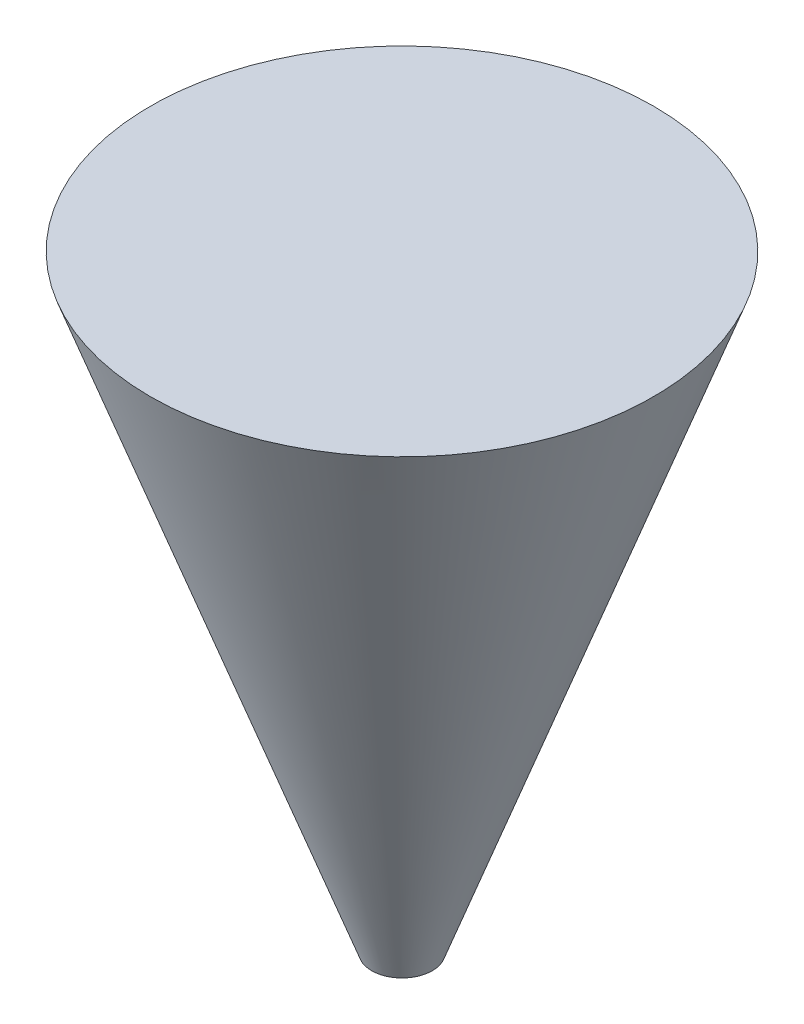
ISO-10303-21;
HEADER;
FILE_DESCRIPTION(('STEP AP214'),'2;1');
FILE_NAME('part.step','',(''),(''),'','','');
FILE_SCHEMA(('AUTOMOTIVE_DESIGN { 1 0 10303 214 1 1 1 1 }'));
ENDSEC;
DATA;
#1=APPLICATION_CONTEXT('core data for automotive mechanical design processes');
#2=APPLICATION_PROTOCOL_DEFINITION('international standard','automotive_design',2000,#1);
#3=PRODUCT_CONTEXT('',#1,'mechanical');
#4=PRODUCT('Part','Part','',(#3));
#5=PRODUCT_RELATED_PRODUCT_CATEGORY('part','',(#4));
#6=PRODUCT_DEFINITION_FORMATION('','',#4);
#7=PRODUCT_DEFINITION_CONTEXT('part definition',#1,'design');
#8=PRODUCT_DEFINITION('design','',#6,#7);
#9=PRODUCT_DEFINITION_SHAPE('','',#8);
#10=(LENGTH_UNIT() NAMED_UNIT(*) SI_UNIT(.MILLI.,.METRE.));
#11=(NAMED_UNIT(*) PLANE_ANGLE_UNIT() SI_UNIT($,.RADIAN.));
#12=(NAMED_UNIT(*) SI_UNIT($,.STERADIAN.) SOLID_ANGLE_UNIT());
#13=UNCERTAINTY_MEASURE_WITH_UNIT(LENGTH_MEASURE(1.E-05),#10,'distance_accuracy_value','');
#14=(GEOMETRIC_REPRESENTATION_CONTEXT(3) GLOBAL_UNCERTAINTY_ASSIGNED_CONTEXT((#13)) GLOBAL_UNIT_ASSIGNED_CONTEXT((#10,
#11,#12)) REPRESENTATION_CONTEXT('',''));
#15=CARTESIAN_POINT('',(0.,0.,0.));
#16=DIRECTION('',(0.,0.,1.));
#17=DIRECTION('',(1.,0.,0.));
#18=AXIS2_PLACEMENT_3D('',#15,#16,#17);
#19=CARTESIAN_POINT('',(0.,254.,0.));
#20=DIRECTION('',(0.,1.,0.));
#21=DIRECTION('',(0.,0.,1.));
#22=AXIS2_PLACEMENT_3D('',#19,#20,#21);
#23=PLANE('',#22);
#24=CARTESIAN_POINT('',(0.,254.,0.));
#25=DIRECTION('',(0.,1.,0.));
#26=DIRECTION('',(0.,0.,1.));
#27=AXIS2_PLACEMENT_3D('',#24,#25,#26);
#28=CIRCLE('',#27,105.148439503614);
#29=CARTESIAN_POINT('',(0.,254.,105.148439503614));
#30=VERTEX_POINT('',#29);
#31=EDGE_CURVE('E11',#30,#30,#28,.T.);
#32=ORIENTED_EDGE('',*,*,#31,.T.);
#33=EDGE_LOOP('',(#32));
#34=FACE_BOUND('',#33,.T.);
#35=ADVANCED_FACE('F47',(#34),#23,.T.);
#36=CARTESIAN_POINT('',(0.,0.,0.));
#37=DIRECTION('',(0.,1.,0.));
#38=DIRECTION('',(0.,0.,1.));
#39=AXIS2_PLACEMENT_3D('',#36,#37,#38);
#40=PLANE('',#39);
#41=CARTESIAN_POINT('',(0.,0.,0.));
#42=DIRECTION('',(0.,1.,0.));
#43=DIRECTION('',(0.,0.,1.));
#44=AXIS2_PLACEMENT_3D('',#41,#42,#43);
#45=CIRCLE('',#44,12.7);
#46=CARTESIAN_POINT('',(0.,0.,12.7));
#47=VERTEX_POINT('',#46);
#48=EDGE_CURVE('E56',#47,#47,#45,.T.);
#49=ORIENTED_EDGE('',*,*,#48,.F.);
#50=EDGE_LOOP('',(#49));
#51=FACE_BOUND('',#50,.T.);
#52=ADVANCED_FACE('F80',(#51),#40,.F.);
#53=CARTESIAN_POINT('',(0.,0.,0.));
#54=DIRECTION('',(0.,1.,0.));
#55=DIRECTION('',(0.,0.,1.));
#56=AXIS2_PLACEMENT_3D('',#53,#54,#55);
#57=CONICAL_SURFACE('',#56,12.7,0.34906585039886);
#58=CARTESIAN_POINT('',(0.,0.,12.7));
#59=CARTESIAN_POINT('',(0.,2.64583333333334,13.6630045781626));
#60=CARTESIAN_POINT('',(0.,5.29166666666667,14.6260091563253));
#61=CARTESIAN_POINT('',(0.,10.5833333333333,16.5520183126506));
#62=CARTESIAN_POINT('',(0.,13.2291666666667,17.5150228908132));
#63=CARTESIAN_POINT('',(0.,18.5208333333333,19.4410320471385));
#64=CARTESIAN_POINT('',(0.,21.1666666666667,20.4040366253011));
#65=CARTESIAN_POINT('',(0.,26.4583333333333,22.3300457816264));
#66=CARTESIAN_POINT('',(0.,29.1041666666667,23.2930503597891));
#67=CARTESIAN_POINT('',(0.,34.3958333333333,25.2190595161143));
#68=CARTESIAN_POINT('',(0.,37.0416666666667,26.182064094277));
#69=CARTESIAN_POINT('',(0.,42.3333333333333,28.1080732506023));
#70=CARTESIAN_POINT('',(0.,44.9791666666667,29.0710778287649));
#71=CARTESIAN_POINT('',(0.,50.2708333333333,30.9970869850902));
#72=CARTESIAN_POINT('',(0.,52.9166666666667,31.9600915632528));
#73=CARTESIAN_POINT('',(0.,58.2083333333333,33.8861007195781));
#74=CARTESIAN_POINT('',(0.,60.8541666666667,34.8491052977408));
#75=CARTESIAN_POINT('',(0.,66.1458333333333,36.775114454066));
#76=CARTESIAN_POINT('',(0.,68.7916666666667,37.7381190322287));
#77=CARTESIAN_POINT('',(0.,74.0833333333333,39.664128188554));
#78=CARTESIAN_POINT('',(0.,76.7291666666667,40.6271327667166));
#79=CARTESIAN_POINT('',(0.,82.0208333333333,42.5531419230419));
#80=CARTESIAN_POINT('',(0.,84.6666666666667,43.5161465012045));
#81=CARTESIAN_POINT('',(0.,89.9583333333333,45.4421556575298));
#82=CARTESIAN_POINT('',(0.,92.6041666666667,46.4051602356925));
#83=CARTESIAN_POINT('',(0.,97.8958333333333,48.3311693920177));
#84=CARTESIAN_POINT('',(0.,100.541666666667,49.2941739701804));
#85=CARTESIAN_POINT('',(0.,105.833333333333,51.2201831265057));
#86=CARTESIAN_POINT('',(0.,108.479166666667,52.1831877046683));
#87=CARTESIAN_POINT('',(0.,113.770833333333,54.1091968609936));
#88=CARTESIAN_POINT('',(0.,116.416666666667,55.0722014391562));
#89=CARTESIAN_POINT('',(0.,121.708333333333,56.9982105954815));
#90=CARTESIAN_POINT('',(0.,124.354166666667,57.9612151736442));
#91=CARTESIAN_POINT('',(0.,129.645833333333,59.8872243299694));
#92=CARTESIAN_POINT('',(0.,132.291666666667,60.8502289081321));
#93=CARTESIAN_POINT('',(0.,137.583333333333,62.7762380644574));
#94=CARTESIAN_POINT('',(0.,140.229166666667,63.73924264262));
#95=CARTESIAN_POINT('',(0.,145.520833333333,65.6652517989453));
#96=CARTESIAN_POINT('',(0.,148.166666666667,66.6282563771079));
#97=CARTESIAN_POINT('',(0.,153.458333333333,68.5542655334332));
#98=CARTESIAN_POINT('',(0.,156.104166666667,69.5172701115959));
#99=CARTESIAN_POINT('',(0.,161.395833333333,71.4432792679212));
#100=CARTESIAN_POINT('',(0.,164.041666666667,72.4062838460838));
#101=CARTESIAN_POINT('',(0.,169.333333333333,74.3322930024091));
#102=CARTESIAN_POINT('',(0.,171.979166666667,75.2952975805717));
#103=CARTESIAN_POINT('',(0.,177.270833333333,77.221306736897));
#104=CARTESIAN_POINT('',(0.,179.916666666667,78.1843113150596));
#105=CARTESIAN_POINT('',(0.,185.208333333333,80.1103204713849));
#106=CARTESIAN_POINT('',(0.,187.854166666667,81.0733250495476));
#107=CARTESIAN_POINT('',(0.,193.145833333333,82.9993342058729));
#108=CARTESIAN_POINT('',(0.,195.791666666667,83.9623387840355));
#109=CARTESIAN_POINT('',(0.,201.083333333333,85.8883479403608));
#110=CARTESIAN_POINT('',(0.,203.729166666667,86.8513525185234));
#111=CARTESIAN_POINT('',(0.,209.020833333333,88.7773616748487));
#112=CARTESIAN_POINT('',(0.,211.666666666667,89.7403662530113));
#113=CARTESIAN_POINT('',(0.,216.958333333333,91.6663754093366));
#114=CARTESIAN_POINT('',(0.,219.604166666667,92.6293799874993));
#115=CARTESIAN_POINT('',(0.,224.895833333333,94.5553891438246));
#116=CARTESIAN_POINT('',(0.,227.541666666667,95.5183937219872));
#117=CARTESIAN_POINT('',(0.,232.833333333333,97.4444028783125));
#118=CARTESIAN_POINT('',(0.,235.479166666667,98.4074074564751));
#119=CARTESIAN_POINT('',(0.,240.770833333333,100.3334166128));
#120=CARTESIAN_POINT('',(0.,243.416666666667,101.296421190963));
#121=CARTESIAN_POINT('',(0.,248.708333333333,103.222430347288));
#122=CARTESIAN_POINT('',(0.,251.354166666667,104.185434925451));
#123=CARTESIAN_POINT('',(0.,254.,105.148439503614));
#124=B_SPLINE_CURVE_WITH_KNOTS('',3,(#58,#59,#60,#61,#62,#63,#64,#65,#66,#67,#68,#69,#70,#71,
#72,#73,#74,#75,#76,#77,#78,#79,#80,#81,#82,#83,#84,#85,#86,#87,#88,#89,#90,#91,#92,#93,#94,#95,
#96,#97,#98,#99,#100,#101,#102,#103,#104,#105,#106,#107,#108,#109,#110,#111,#112,#113,#114,#115,
#116,#117,#118,#119,#120,#121,#122,#123),.UNSPECIFIED.,.F.,.F.,(4,2,2,2,2,2,2,2,2,2,2,2,2,2,2,2,
2,2,2,2,2,2,2,2,2,2,2,2,2,2,2,2,4),(0.,8.44691106902753,16.8938221380551,25.3407332070826,
33.7876442761101,42.2345553451377,50.6814664141652,59.1283774831927,67.5752885522203,
76.0221996212478,84.4691106902754,92.9160217593029,101.36293282833,109.809843897358,
118.256754966385,126.703666035413,135.150577104441,143.597488173468,152.044399242496,
160.491310311523,168.938221380551,177.385132449578,185.832043518606,194.278954587633,
202.725865656661,211.172776725688,219.619687794716,228.066598863743,236.513509932771,
244.960421001798,253.407332070826,261.854243139854,270.301154208881),.UNSPECIFIED.);
#125=EDGE_CURVE('BSEAM88',#47,#30,#124,.T.);
#126=ORIENTED_EDGE('',*,*,#48,.T.);
#127=ORIENTED_EDGE('',*,*,#31,.F.);
#128=ORIENTED_EDGE('',*,*,#125,.T.);
#129=ORIENTED_EDGE('',*,*,#125,.F.);
#130=EDGE_LOOP('',(#126,#128,#127,#129));
#131=FACE_BOUND('',#130,.T.);
#132=ADVANCED_FACE('F88',(#131),#57,.T.);
#133=CLOSED_SHELL('',(#35,#52,#132));
#134=MANIFOLD_SOLID_BREP('B2',#133);
#135=ADVANCED_BREP_SHAPE_REPRESENTATION('',(#18,#134),#14);
#136=SHAPE_DEFINITION_REPRESENTATION(#9,#135);
ENDSEC;
END-ISO-10303-21;
